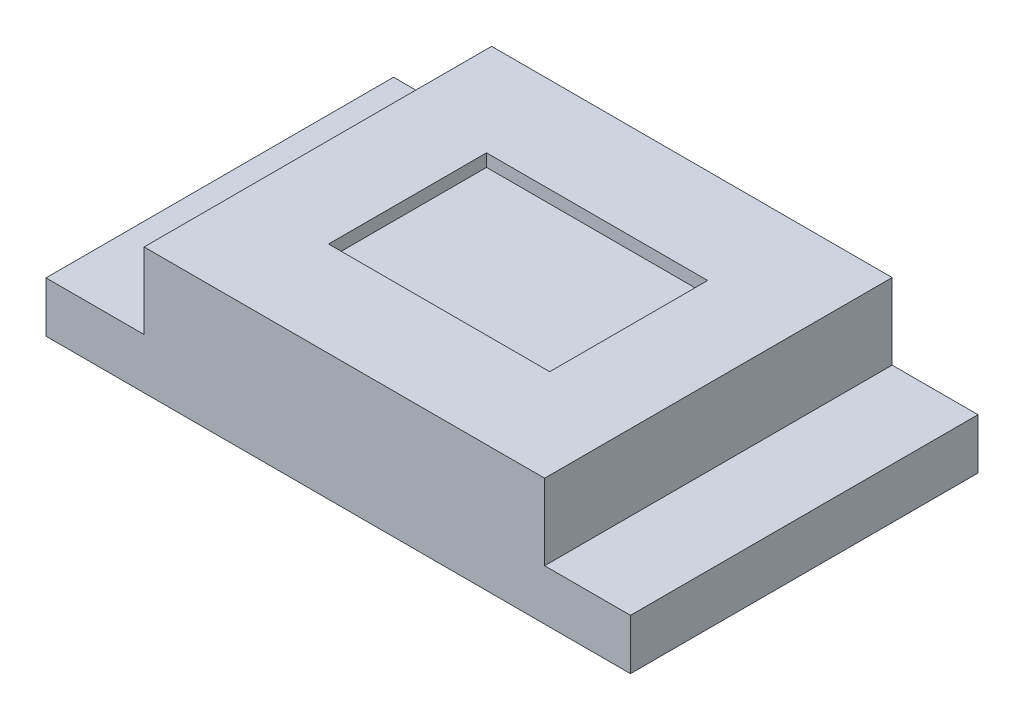
ISO-10303-21;
HEADER;
FILE_DESCRIPTION(('STEP AP214'),'2;1');
FILE_NAME('part.step','',(''),(''),'','','');
FILE_SCHEMA(('AUTOMOTIVE_DESIGN { 1 0 10303 214 1 1 1 1 }'));
ENDSEC;
DATA;
#1=APPLICATION_CONTEXT('core data for automotive mechanical design processes');
#2=APPLICATION_PROTOCOL_DEFINITION('international standard','automotive_design',2000,#1);
#3=PRODUCT_CONTEXT('',#1,'mechanical');
#4=PRODUCT('Part','Part','',(#3));
#5=PRODUCT_RELATED_PRODUCT_CATEGORY('part','',(#4));
#6=PRODUCT_DEFINITION_FORMATION('','',#4);
#7=PRODUCT_DEFINITION_CONTEXT('part definition',#1,'design');
#8=PRODUCT_DEFINITION('design','',#6,#7);
#9=PRODUCT_DEFINITION_SHAPE('','',#8);
#10=(LENGTH_UNIT() NAMED_UNIT(*) SI_UNIT(.MILLI.,.METRE.));
#11=(NAMED_UNIT(*) PLANE_ANGLE_UNIT() SI_UNIT($,.RADIAN.));
#12=(NAMED_UNIT(*) SI_UNIT($,.STERADIAN.) SOLID_ANGLE_UNIT());
#13=UNCERTAINTY_MEASURE_WITH_UNIT(LENGTH_MEASURE(1.E-05),#10,'distance_accuracy_value','');
#14=(GEOMETRIC_REPRESENTATION_CONTEXT(3) GLOBAL_UNCERTAINTY_ASSIGNED_CONTEXT((#13)) GLOBAL_UNIT_ASSIGNED_CONTEXT((#10,
#11,#12)) REPRESENTATION_CONTEXT('',''));
#15=CARTESIAN_POINT('',(0.,0.,0.));
#16=DIRECTION('',(0.,0.,1.));
#17=DIRECTION('',(1.,0.,0.));
#18=AXIS2_PLACEMENT_3D('',#15,#16,#17);
#19=CARTESIAN_POINT('',(0.,25.4,0.));
#20=DIRECTION('',(0.,0.,-1.));
#21=DIRECTION('',(-1.,0.,0.));
#22=AXIS2_PLACEMENT_3D('',#19,#20,#21);
#23=PLANE('',#22);
#24=DIRECTION('',(0.,1.,0.));
#25=VECTOR('',#24,1.);
#26=CARTESIAN_POINT('',(100.218197520377,10.16,0.));
#27=LINE('',#26,#25);
#28=CARTESIAN_POINT('',(100.218197520377,10.16,0.));
#29=VERTEX_POINT('',#28);
#30=CARTESIAN_POINT('',(100.218197520377,25.4,0.));
#31=VERTEX_POINT('',#30);
#32=EDGE_CURVE('E172',#29,#31,#27,.T.);
#33=ORIENTED_EDGE('',*,*,#32,.T.);
#34=DIRECTION('',(1.,0.,0.));
#35=VECTOR('',#34,1.);
#36=CARTESIAN_POINT('',(0.,25.4,0.));
#37=LINE('',#36,#35);
#38=CARTESIAN_POINT('',(19.7161815205043,25.4,0.));
#39=VERTEX_POINT('',#38);
#40=EDGE_CURVE('E197',#39,#31,#37,.T.);
#41=ORIENTED_EDGE('',*,*,#40,.F.);
#42=DIRECTION('',(0.,1.,0.));
#43=VECTOR('',#42,1.);
#44=CARTESIAN_POINT('',(19.7161815205043,10.16,0.));
#45=LINE('',#44,#43);
#46=CARTESIAN_POINT('',(19.7161815205043,10.16,0.));
#47=VERTEX_POINT('',#46);
#48=EDGE_CURVE('E192',#47,#39,#45,.T.);
#49=ORIENTED_EDGE('',*,*,#48,.F.);
#50=DIRECTION('',(1.,0.,0.));
#51=VECTOR('',#50,1.);
#52=CARTESIAN_POINT('',(0.,10.16,0.));
#53=LINE('',#52,#51);
#54=CARTESIAN_POINT('',(0.,10.16,0.));
#55=VERTEX_POINT('',#54);
#56=EDGE_CURVE('E186',#55,#47,#53,.T.);
#57=ORIENTED_EDGE('',*,*,#56,.F.);
#58=DIRECTION('',(0.,-1.,0.));
#59=VECTOR('',#58,1.);
#60=CARTESIAN_POINT('',(0.,25.4,0.));
#61=LINE('',#60,#59);
#62=CARTESIAN_POINT('',(0.,0.,0.));
#63=VERTEX_POINT('',#62);
#64=EDGE_CURVE('E11',#55,#63,#61,.T.);
#65=ORIENTED_EDGE('',*,*,#64,.T.);
#66=DIRECTION('',(1.,0.,0.));
#67=VECTOR('',#66,1.);
#68=CARTESIAN_POINT('',(0.,0.,0.));
#69=LINE('',#68,#67);
#70=CARTESIAN_POINT('',(117.475,0.,0.));
#71=VERTEX_POINT('',#70);
#72=EDGE_CURVE('E206',#63,#71,#69,.T.);
#73=ORIENTED_EDGE('',*,*,#72,.T.);
#74=DIRECTION('',(0.,-1.,0.));
#75=VECTOR('',#74,1.);
#76=CARTESIAN_POINT('',(117.475,25.4,0.));
#77=LINE('',#76,#75);
#78=CARTESIAN_POINT('',(117.475,10.16,0.));
#79=VERTEX_POINT('',#78);
#80=EDGE_CURVE('E45',#79,#71,#77,.T.);
#81=ORIENTED_EDGE('',*,*,#80,.F.);
#82=DIRECTION('',(1.,0.,0.));
#83=VECTOR('',#82,1.);
#84=CARTESIAN_POINT('',(0.,10.16,0.));
#85=LINE('',#84,#83);
#86=EDGE_CURVE('E60',#29,#79,#85,.T.);
#87=ORIENTED_EDGE('',*,*,#86,.F.);
#88=EDGE_LOOP('',(#33,#41,#49,#57,#65,#73,#81,#87));
#89=FACE_BOUND('',#88,.T.);
#90=ADVANCED_FACE('F37',(#89),#23,.F.);
#91=CARTESIAN_POINT('',(0.,25.4,-69.85));
#92=DIRECTION('',(0.,0.,1.));
#93=DIRECTION('',(1.,0.,0.));
#94=AXIS2_PLACEMENT_3D('',#91,#92,#93);
#95=PLANE('',#94);
#96=DIRECTION('',(0.,1.,0.));
#97=VECTOR('',#96,1.);
#98=CARTESIAN_POINT('',(100.218197520377,10.16,-69.85));
#99=LINE('',#98,#97);
#100=CARTESIAN_POINT('',(100.218197520377,10.16,-69.85));
#101=VERTEX_POINT('',#100);
#102=CARTESIAN_POINT('',(100.218197520377,25.4,-69.85));
#103=VERTEX_POINT('',#102);
#104=EDGE_CURVE('E175',#101,#103,#99,.T.);
#105=ORIENTED_EDGE('',*,*,#104,.F.);
#106=DIRECTION('',(-1.,0.,0.));
#107=VECTOR('',#106,1.);
#108=CARTESIAN_POINT('',(0.,10.16,-69.85));
#109=LINE('',#108,#107);
#110=CARTESIAN_POINT('',(117.475,10.16,-69.85));
#111=VERTEX_POINT('',#110);
#112=EDGE_CURVE('E169',#111,#101,#109,.T.);
#113=ORIENTED_EDGE('',*,*,#112,.F.);
#114=DIRECTION('',(0.,-1.,0.));
#115=VECTOR('',#114,1.);
#116=CARTESIAN_POINT('',(117.475,25.4,-69.85));
#117=LINE('',#116,#115);
#118=CARTESIAN_POINT('',(117.475,0.,-69.85));
#119=VERTEX_POINT('',#118);
#120=EDGE_CURVE('E215',#111,#119,#117,.T.);
#121=ORIENTED_EDGE('',*,*,#120,.T.);
#122=DIRECTION('',(-1.,0.,0.));
#123=VECTOR('',#122,1.);
#124=CARTESIAN_POINT('',(0.,0.,-69.85));
#125=LINE('',#124,#123);
#126=CARTESIAN_POINT('',(0.,0.,-69.85));
#127=VERTEX_POINT('',#126);
#128=EDGE_CURVE('E201',#119,#127,#125,.T.);
#129=ORIENTED_EDGE('',*,*,#128,.T.);
#130=DIRECTION('',(0.,-1.,0.));
#131=VECTOR('',#130,1.);
#132=CARTESIAN_POINT('',(0.,25.4,-69.85));
#133=LINE('',#132,#131);
#134=CARTESIAN_POINT('',(0.,10.16,-69.85));
#135=VERTEX_POINT('',#134);
#136=EDGE_CURVE('E203',#135,#127,#133,.T.);
#137=ORIENTED_EDGE('',*,*,#136,.F.);
#138=DIRECTION('',(-1.,0.,0.));
#139=VECTOR('',#138,1.);
#140=CARTESIAN_POINT('',(0.,10.16,-69.85));
#141=LINE('',#140,#139);
#142=CARTESIAN_POINT('',(19.7161815205043,10.16,-69.85));
#143=VERTEX_POINT('',#142);
#144=EDGE_CURVE('E182',#143,#135,#141,.T.);
#145=ORIENTED_EDGE('',*,*,#144,.F.);
#146=DIRECTION('',(0.,1.,0.));
#147=VECTOR('',#146,1.);
#148=CARTESIAN_POINT('',(19.7161815205043,10.16,-69.85));
#149=LINE('',#148,#147);
#150=CARTESIAN_POINT('',(19.7161815205043,25.4,-69.85));
#151=VERTEX_POINT('',#150);
#152=EDGE_CURVE('E189',#143,#151,#149,.T.);
#153=ORIENTED_EDGE('',*,*,#152,.T.);
#154=DIRECTION('',(-1.,0.,0.));
#155=VECTOR('',#154,1.);
#156=CARTESIAN_POINT('',(0.,25.4,-69.85));
#157=LINE('',#156,#155);
#158=EDGE_CURVE('E200',#103,#151,#157,.T.);
#159=ORIENTED_EDGE('',*,*,#158,.F.);
#160=EDGE_LOOP('',(#105,#113,#121,#129,#137,#145,#153,#159));
#161=FACE_BOUND('',#160,.T.);
#162=ADVANCED_FACE('F232',(#161),#95,.F.);
#163=CARTESIAN_POINT('',(0.,25.4,0.));
#164=DIRECTION('',(0.,-1.,0.));
#165=DIRECTION('',(0.,0.,-1.));
#166=AXIS2_PLACEMENT_3D('',#163,#164,#165);
#167=PLANE('',#166);
#168=DIRECTION('',(0.,0.,-1.));
#169=VECTOR('',#168,1.);
#170=CARTESIAN_POINT('',(82.1921895204406,25.4,0.));
#171=LINE('',#170,#169);
#172=CARTESIAN_POINT('',(82.1921895204406,25.4,-19.05));
#173=VERTEX_POINT('',#172);
#174=CARTESIAN_POINT('',(82.1921895204406,25.4,-50.8));
#175=VERTEX_POINT('',#174);
#176=EDGE_CURVE('E154',#173,#175,#171,.T.);
#177=ORIENTED_EDGE('',*,*,#176,.F.);
#178=DIRECTION('',(1.,0.,0.));
#179=VECTOR('',#178,1.);
#180=CARTESIAN_POINT('',(0.,25.4,-19.05));
#181=LINE('',#180,#179);
#182=CARTESIAN_POINT('',(37.7421895204406,25.4,-19.05));
#183=VERTEX_POINT('',#182);
#184=EDGE_CURVE('E52',#183,#173,#181,.T.);
#185=ORIENTED_EDGE('',*,*,#184,.F.);
#186=DIRECTION('',(0.,0.,-1.));
#187=VECTOR('',#186,1.);
#188=CARTESIAN_POINT('',(37.7421895204406,25.4,0.));
#189=LINE('',#188,#187);
#190=CARTESIAN_POINT('',(37.7421895204406,25.4,-50.8));
#191=VERTEX_POINT('',#190);
#192=EDGE_CURVE('E145',#183,#191,#189,.T.);
#193=ORIENTED_EDGE('',*,*,#192,.T.);
#194=DIRECTION('',(1.,0.,0.));
#195=VECTOR('',#194,1.);
#196=CARTESIAN_POINT('',(0.,25.4,-50.8));
#197=LINE('',#196,#195);
#198=EDGE_CURVE('E148',#191,#175,#197,.T.);
#199=ORIENTED_EDGE('',*,*,#198,.T.);
#200=EDGE_LOOP('',(#177,#185,#193,#199));
#201=FACE_BOUND('',#200,.T.);
#202=DIRECTION('',(0.,0.,-1.));
#203=VECTOR('',#202,1.);
#204=CARTESIAN_POINT('',(100.218197520377,25.4,0.));
#205=LINE('',#204,#203);
#206=EDGE_CURVE('E160',#31,#103,#205,.T.);
#207=ORIENTED_EDGE('',*,*,#206,.T.);
#208=ORIENTED_EDGE('',*,*,#158,.T.);
#209=DIRECTION('',(0.,0.,1.));
#210=VECTOR('',#209,1.);
#211=CARTESIAN_POINT('',(19.7161815205043,25.4,0.));
#212=LINE('',#211,#210);
#213=EDGE_CURVE('E177',#151,#39,#212,.T.);
#214=ORIENTED_EDGE('',*,*,#213,.T.);
#215=ORIENTED_EDGE('',*,*,#40,.T.);
#216=EDGE_LOOP('',(#207,#208,#214,#215));
#217=FACE_BOUND('',#216,.T.);
#218=ADVANCED_FACE('F241',(#201,#217),#167,.F.);
#219=CARTESIAN_POINT('',(117.475,25.4,0.));
#220=DIRECTION('',(-1.,0.,0.));
#221=DIRECTION('',(0.,0.,1.));
#222=AXIS2_PLACEMENT_3D('',#219,#220,#221);
#223=PLANE('',#222);
#224=DIRECTION('',(0.,0.,-1.));
#225=VECTOR('',#224,1.);
#226=CARTESIAN_POINT('',(117.475,10.16,0.));
#227=LINE('',#226,#225);
#228=EDGE_CURVE('E167',#79,#111,#227,.T.);
#229=ORIENTED_EDGE('',*,*,#228,.F.);
#230=ORIENTED_EDGE('',*,*,#80,.T.);
#231=DIRECTION('',(0.,0.,-1.));
#232=VECTOR('',#231,1.);
#233=CARTESIAN_POINT('',(117.475,0.,0.));
#234=LINE('',#233,#232);
#235=EDGE_CURVE('E209',#71,#119,#234,.T.);
#236=ORIENTED_EDGE('',*,*,#235,.T.);
#237=ORIENTED_EDGE('',*,*,#120,.F.);
#238=EDGE_LOOP('',(#229,#230,#236,#237));
#239=FACE_BOUND('',#238,.T.);
#240=ADVANCED_FACE('F218',(#239),#223,.F.);
#241=CARTESIAN_POINT('',(0.,25.4,0.));
#242=DIRECTION('',(1.,0.,0.));
#243=DIRECTION('',(0.,0.,-1.));
#244=AXIS2_PLACEMENT_3D('',#241,#242,#243);
#245=PLANE('',#244);
#246=DIRECTION('',(0.,0.,1.));
#247=VECTOR('',#246,1.);
#248=CARTESIAN_POINT('',(0.,10.16,0.));
#249=LINE('',#248,#247);
#250=EDGE_CURVE('E184',#135,#55,#249,.T.);
#251=ORIENTED_EDGE('',*,*,#250,.F.);
#252=ORIENTED_EDGE('',*,*,#136,.T.);
#253=DIRECTION('',(0.,0.,1.));
#254=VECTOR('',#253,1.);
#255=CARTESIAN_POINT('',(0.,0.,0.));
#256=LINE('',#255,#254);
#257=EDGE_CURVE('E194',#127,#63,#256,.T.);
#258=ORIENTED_EDGE('',*,*,#257,.T.);
#259=ORIENTED_EDGE('',*,*,#64,.F.);
#260=EDGE_LOOP('',(#251,#252,#258,#259));
#261=FACE_BOUND('',#260,.T.);
#262=ADVANCED_FACE('F39',(#261),#245,.F.);
#263=CARTESIAN_POINT('',(0.,0.,0.));
#264=DIRECTION('',(0.,-1.,0.));
#265=DIRECTION('',(0.,0.,-1.));
#266=AXIS2_PLACEMENT_3D('',#263,#264,#265);
#267=PLANE('',#266);
#268=ORIENTED_EDGE('',*,*,#257,.F.);
#269=ORIENTED_EDGE('',*,*,#128,.F.);
#270=ORIENTED_EDGE('',*,*,#235,.F.);
#271=ORIENTED_EDGE('',*,*,#72,.F.);
#272=EDGE_LOOP('',(#268,#269,#270,#271));
#273=FACE_BOUND('',#272,.T.);
#274=ADVANCED_FACE('F228',(#273),#267,.T.);
#275=CARTESIAN_POINT('',(19.7161815205043,10.16,0.));
#276=DIRECTION('',(-1.,0.,0.));
#277=DIRECTION('',(0.,0.,1.));
#278=AXIS2_PLACEMENT_3D('',#275,#276,#277);
#279=PLANE('',#278);
#280=ORIENTED_EDGE('',*,*,#213,.F.);
#281=ORIENTED_EDGE('',*,*,#152,.F.);
#282=DIRECTION('',(0.,0.,1.));
#283=VECTOR('',#282,1.);
#284=CARTESIAN_POINT('',(19.7161815205043,10.16,0.));
#285=LINE('',#284,#283);
#286=EDGE_CURVE('E180',#143,#47,#285,.T.);
#287=ORIENTED_EDGE('',*,*,#286,.T.);
#288=ORIENTED_EDGE('',*,*,#48,.T.);
#289=EDGE_LOOP('',(#280,#281,#287,#288));
#290=FACE_BOUND('',#289,.T.);
#291=ADVANCED_FACE('F244',(#290),#279,.T.);
#292=CARTESIAN_POINT('',(0.,10.16,0.));
#293=DIRECTION('',(0.,1.,0.));
#294=DIRECTION('',(0.,0.,1.));
#295=AXIS2_PLACEMENT_3D('',#292,#293,#294);
#296=PLANE('',#295);
#297=ORIENTED_EDGE('',*,*,#286,.F.);
#298=ORIENTED_EDGE('',*,*,#144,.T.);
#299=ORIENTED_EDGE('',*,*,#250,.T.);
#300=ORIENTED_EDGE('',*,*,#56,.T.);
#301=EDGE_LOOP('',(#297,#298,#299,#300));
#302=FACE_BOUND('',#301,.T.);
#303=ADVANCED_FACE('F248',(#302),#296,.T.);
#304=CARTESIAN_POINT('',(100.218197520377,10.16,0.));
#305=DIRECTION('',(1.,0.,0.));
#306=DIRECTION('',(0.,0.,-1.));
#307=AXIS2_PLACEMENT_3D('',#304,#305,#306);
#308=PLANE('',#307);
#309=ORIENTED_EDGE('',*,*,#206,.F.);
#310=ORIENTED_EDGE('',*,*,#32,.F.);
#311=DIRECTION('',(0.,0.,-1.));
#312=VECTOR('',#311,1.);
#313=CARTESIAN_POINT('',(100.218197520377,10.16,0.));
#314=LINE('',#313,#312);
#315=EDGE_CURVE('E164',#29,#101,#314,.T.);
#316=ORIENTED_EDGE('',*,*,#315,.T.);
#317=ORIENTED_EDGE('',*,*,#104,.T.);
#318=EDGE_LOOP('',(#309,#310,#316,#317));
#319=FACE_BOUND('',#318,.T.);
#320=ADVANCED_FACE('F270',(#319),#308,.T.);
#321=CARTESIAN_POINT('',(0.,10.16,0.));
#322=DIRECTION('',(0.,1.,0.));
#323=DIRECTION('',(0.,0.,1.));
#324=AXIS2_PLACEMENT_3D('',#321,#322,#323);
#325=PLANE('',#324);
#326=ORIENTED_EDGE('',*,*,#315,.F.);
#327=ORIENTED_EDGE('',*,*,#86,.T.);
#328=ORIENTED_EDGE('',*,*,#228,.T.);
#329=ORIENTED_EDGE('',*,*,#112,.T.);
#330=EDGE_LOOP('',(#326,#327,#328,#329));
#331=FACE_BOUND('',#330,.T.);
#332=ADVANCED_FACE('F236',(#331),#325,.T.);
#333=CARTESIAN_POINT('',(0.,22.86,-19.05));
#334=DIRECTION('',(0.,0.,1.));
#335=DIRECTION('',(1.,0.,0.));
#336=AXIS2_PLACEMENT_3D('',#333,#334,#335);
#337=PLANE('',#336);
#338=ORIENTED_EDGE('',*,*,#184,.T.);
#339=DIRECTION('',(0.,1.,0.));
#340=VECTOR('',#339,1.);
#341=CARTESIAN_POINT('',(82.1921895204406,22.86,-19.05));
#342=LINE('',#341,#340);
#343=CARTESIAN_POINT('',(82.1921895204406,22.86,-19.05));
#344=VERTEX_POINT('',#343);
#345=EDGE_CURVE('E124',#344,#173,#342,.T.);
#346=ORIENTED_EDGE('',*,*,#345,.F.);
#347=DIRECTION('',(1.,0.,0.));
#348=VECTOR('',#347,1.);
#349=CARTESIAN_POINT('',(0.,22.86,-19.05));
#350=LINE('',#349,#348);
#351=CARTESIAN_POINT('',(37.7421895204406,22.86,-19.05));
#352=VERTEX_POINT('',#351);
#353=EDGE_CURVE('E128',#352,#344,#350,.T.);
#354=ORIENTED_EDGE('',*,*,#353,.F.);
#355=DIRECTION('',(0.,1.,0.));
#356=VECTOR('',#355,1.);
#357=CARTESIAN_POINT('',(37.7421895204406,22.86,-19.05));
#358=LINE('',#357,#356);
#359=EDGE_CURVE('E158',#352,#183,#358,.T.);
#360=ORIENTED_EDGE('',*,*,#359,.T.);
#361=EDGE_LOOP('',(#338,#346,#354,#360));
#362=FACE_BOUND('',#361,.T.);
#363=ADVANCED_FACE('F126',(#362),#337,.F.);
#364=CARTESIAN_POINT('',(37.7421895204406,22.86,0.));
#365=DIRECTION('',(1.,0.,0.));
#366=DIRECTION('',(0.,0.,-1.));
#367=AXIS2_PLACEMENT_3D('',#364,#365,#366);
#368=PLANE('',#367);
#369=ORIENTED_EDGE('',*,*,#192,.F.);
#370=ORIENTED_EDGE('',*,*,#359,.F.);
#371=DIRECTION('',(0.,0.,-1.));
#372=VECTOR('',#371,1.);
#373=CARTESIAN_POINT('',(37.7421895204406,22.86,0.));
#374=LINE('',#373,#372);
#375=CARTESIAN_POINT('',(37.7421895204406,22.86,-50.8));
#376=VERTEX_POINT('',#375);
#377=EDGE_CURVE('E133',#352,#376,#374,.T.);
#378=ORIENTED_EDGE('',*,*,#377,.T.);
#379=DIRECTION('',(0.,1.,0.));
#380=VECTOR('',#379,1.);
#381=CARTESIAN_POINT('',(37.7421895204406,22.86,-50.8));
#382=LINE('',#381,#380);
#383=EDGE_CURVE('E161',#376,#191,#382,.T.);
#384=ORIENTED_EDGE('',*,*,#383,.T.);
#385=EDGE_LOOP('',(#369,#370,#378,#384));
#386=FACE_BOUND('',#385,.T.);
#387=ADVANCED_FACE('F277',(#386),#368,.T.);
#388=CARTESIAN_POINT('',(0.,22.86,-50.8));
#389=DIRECTION('',(0.,0.,1.));
#390=DIRECTION('',(1.,0.,0.));
#391=AXIS2_PLACEMENT_3D('',#388,#389,#390);
#392=PLANE('',#391);
#393=ORIENTED_EDGE('',*,*,#198,.F.);
#394=ORIENTED_EDGE('',*,*,#383,.F.);
#395=DIRECTION('',(1.,0.,0.));
#396=VECTOR('',#395,1.);
#397=CARTESIAN_POINT('',(0.,22.86,-50.8));
#398=LINE('',#397,#396);
#399=CARTESIAN_POINT('',(82.1921895204406,22.86,-50.8));
#400=VERTEX_POINT('',#399);
#401=EDGE_CURVE('E141',#376,#400,#398,.T.);
#402=ORIENTED_EDGE('',*,*,#401,.T.);
#403=DIRECTION('',(0.,1.,0.));
#404=VECTOR('',#403,1.);
#405=CARTESIAN_POINT('',(82.1921895204406,22.86,-50.8));
#406=LINE('',#405,#404);
#407=EDGE_CURVE('E132',#400,#175,#406,.T.);
#408=ORIENTED_EDGE('',*,*,#407,.T.);
#409=EDGE_LOOP('',(#393,#394,#402,#408));
#410=FACE_BOUND('',#409,.T.);
#411=ADVANCED_FACE('F280',(#410),#392,.T.);
#412=CARTESIAN_POINT('',(82.1921895204406,22.86,0.));
#413=DIRECTION('',(1.,0.,0.));
#414=DIRECTION('',(0.,0.,-1.));
#415=AXIS2_PLACEMENT_3D('',#412,#413,#414);
#416=PLANE('',#415);
#417=ORIENTED_EDGE('',*,*,#176,.T.);
#418=ORIENTED_EDGE('',*,*,#407,.F.);
#419=DIRECTION('',(0.,0.,-1.));
#420=VECTOR('',#419,1.);
#421=CARTESIAN_POINT('',(82.1921895204406,22.86,0.));
#422=LINE('',#421,#420);
#423=EDGE_CURVE('E137',#344,#400,#422,.T.);
#424=ORIENTED_EDGE('',*,*,#423,.F.);
#425=ORIENTED_EDGE('',*,*,#345,.T.);
#426=EDGE_LOOP('',(#417,#418,#424,#425));
#427=FACE_BOUND('',#426,.T.);
#428=ADVANCED_FACE('F138',(#427),#416,.F.);
#429=CARTESIAN_POINT('',(0.,22.86,0.));
#430=DIRECTION('',(0.,1.,0.));
#431=DIRECTION('',(0.,0.,1.));
#432=AXIS2_PLACEMENT_3D('',#429,#430,#431);
#433=PLANE('',#432);
#434=ORIENTED_EDGE('',*,*,#353,.T.);
#435=ORIENTED_EDGE('',*,*,#423,.T.);
#436=ORIENTED_EDGE('',*,*,#401,.F.);
#437=ORIENTED_EDGE('',*,*,#377,.F.);
#438=EDGE_LOOP('',(#434,#435,#436,#437));
#439=FACE_BOUND('',#438,.T.);
#440=ADVANCED_FACE('F144',(#439),#433,.T.);
#441=CLOSED_SHELL('',(#90,#162,#218,#240,#262,#274,#291,#303,#320,#332,#363,#387,#411,#428,#440));
#442=MANIFOLD_SOLID_BREP('B2',#441);
#443=ADVANCED_BREP_SHAPE_REPRESENTATION('',(#18,#442),#14);
#444=SHAPE_DEFINITION_REPRESENTATION(#9,#443);
ENDSEC;
END-ISO-10303-21;
